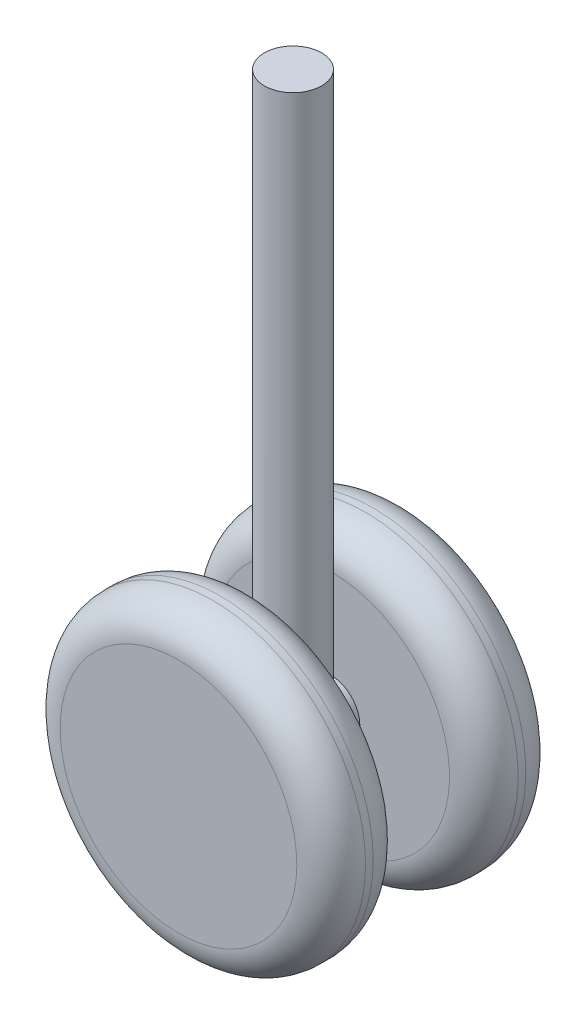
ISO-10303-21;
HEADER;
FILE_DESCRIPTION(('STEP AP214'),'2;1');
FILE_NAME('part.step','',(''),(''),'','','');
FILE_SCHEMA(('AUTOMOTIVE_DESIGN { 1 0 10303 214 1 1 1 1 }'));
ENDSEC;
DATA;
#1=APPLICATION_CONTEXT('core data for automotive mechanical design processes');
#2=APPLICATION_PROTOCOL_DEFINITION('international standard','automotive_design',2000,#1);
#3=PRODUCT_CONTEXT('',#1,'mechanical');
#4=PRODUCT('Part','Part','',(#3));
#5=PRODUCT_RELATED_PRODUCT_CATEGORY('part','',(#4));
#6=PRODUCT_DEFINITION_FORMATION('','',#4);
#7=PRODUCT_DEFINITION_CONTEXT('part definition',#1,'design');
#8=PRODUCT_DEFINITION('design','',#6,#7);
#9=PRODUCT_DEFINITION_SHAPE('','',#8);
#10=(LENGTH_UNIT() NAMED_UNIT(*) SI_UNIT(.MILLI.,.METRE.));
#11=(NAMED_UNIT(*) PLANE_ANGLE_UNIT() SI_UNIT($,.RADIAN.));
#12=(NAMED_UNIT(*) SI_UNIT($,.STERADIAN.) SOLID_ANGLE_UNIT());
#13=UNCERTAINTY_MEASURE_WITH_UNIT(LENGTH_MEASURE(1.E-05),#10,'distance_accuracy_value','');
#14=(GEOMETRIC_REPRESENTATION_CONTEXT(3) GLOBAL_UNCERTAINTY_ASSIGNED_CONTEXT((#13)) GLOBAL_UNIT_ASSIGNED_CONTEXT((#10,
#11,#12)) REPRESENTATION_CONTEXT('',''));
#15=CARTESIAN_POINT('',(0.,0.,0.));
#16=DIRECTION('',(0.,0.,1.));
#17=DIRECTION('',(1.,0.,0.));
#18=AXIS2_PLACEMENT_3D('',#15,#16,#17);
#19=CARTESIAN_POINT('',(0.,0.,-200.));
#20=DIRECTION('',(0.,0.,1.));
#21=DIRECTION('',(1.,0.,0.));
#22=AXIS2_PLACEMENT_3D('',#19,#20,#21);
#23=CYLINDRICAL_SURFACE('',#22,75.);
#24=CARTESIAN_POINT('',(0.,0.,100.));
#25=DIRECTION('',(0.,0.,1.));
#26=DIRECTION('',(1.,0.,0.));
#27=AXIS2_PLACEMENT_3D('',#24,#25,#26);
#28=CIRCLE('',#27,75.);
#29=CARTESIAN_POINT('',(75.,0.,100.));
#30=VERTEX_POINT('',#29);
#31=EDGE_CURVE('E52',#30,#30,#28,.F.);
#32=ORIENTED_EDGE('',*,*,#31,.T.);
#33=EDGE_LOOP('',(#32));
#34=FACE_BOUND('',#33,.T.);
#35=CARTESIAN_POINT('',(0.,0.,0.));
#36=DIRECTION('',(0.,-0.707106781186547,0.707106781186547));
#37=DIRECTION('',(0.,-0.707106781186547,-0.707106781186547));
#38=AXIS2_PLACEMENT_3D('',#35,#36,#37);
#39=ELLIPSE('',#38,106.066017177982,75.);
#40=CARTESIAN_POINT('',(-75.,0.,0.));
#41=VERTEX_POINT('',#40);
#42=CARTESIAN_POINT('',(75.,0.,0.));
#43=VERTEX_POINT('',#42);
#44=EDGE_CURVE('E47',#41,#43,#39,.F.);
#45=ORIENTED_EDGE('',*,*,#44,.F.);
#46=CARTESIAN_POINT('',(0.,0.,0.));
#47=DIRECTION('',(0.,-0.707106781186547,-0.707106781186547));
#48=DIRECTION('',(0.,-0.707106781186547,0.707106781186547));
#49=AXIS2_PLACEMENT_3D('',#46,#47,#48);
#50=ELLIPSE('',#49,106.066017177982,75.);
#51=EDGE_CURVE('E49',#43,#41,#50,.F.);
#52=ORIENTED_EDGE('',*,*,#51,.F.);
#53=EDGE_LOOP('',(#45,#52));
#54=FACE_BOUND('',#53,.T.);
#55=CARTESIAN_POINT('',(0.,0.,-100.));
#56=DIRECTION('',(0.,0.,-1.));
#57=DIRECTION('',(-1.,0.,0.));
#58=AXIS2_PLACEMENT_3D('',#55,#56,#57);
#59=CIRCLE('',#58,75.);
#60=CARTESIAN_POINT('',(-75.,0.,-100.));
#61=VERTEX_POINT('',#60);
#62=EDGE_CURVE('E63',#61,#61,#59,.F.);
#63=ORIENTED_EDGE('',*,*,#62,.T.);
#64=EDGE_LOOP('',(#63));
#65=FACE_BOUND('',#64,.T.);
#66=ADVANCED_FACE('F33',(#34,#54,#65),#23,.T.);
#67=CARTESIAN_POINT('',(0.,1500.,0.));
#68=DIRECTION('',(0.,-1.,0.));
#69=DIRECTION('',(0.,0.,-1.));
#70=AXIS2_PLACEMENT_3D('',#67,#68,#69);
#71=CYLINDRICAL_SURFACE('',#70,75.);
#72=CARTESIAN_POINT('',(0.,1500.,0.));
#73=DIRECTION('',(0.,1.,0.));
#74=DIRECTION('',(0.,0.,1.));
#75=AXIS2_PLACEMENT_3D('',#72,#73,#74);
#76=CIRCLE('',#75,75.);
#77=CARTESIAN_POINT('',(0.,1500.,75.));
#78=VERTEX_POINT('',#77);
#79=EDGE_CURVE('E55',#78,#78,#76,.T.);
#80=ORIENTED_EDGE('',*,*,#79,.F.);
#81=EDGE_LOOP('',(#80));
#82=FACE_BOUND('',#81,.T.);
#83=ORIENTED_EDGE('',*,*,#51,.T.);
#84=ORIENTED_EDGE('',*,*,#44,.T.);
#85=EDGE_LOOP('',(#83,#84));
#86=FACE_BOUND('',#85,.T.);
#87=ADVANCED_FACE('F54',(#82,#86),#71,.T.);
#88=CARTESIAN_POINT('',(0.,1500.,0.));
#89=DIRECTION('',(0.,1.,0.));
#90=DIRECTION('',(0.,0.,1.));
#91=AXIS2_PLACEMENT_3D('',#88,#89,#90);
#92=PLANE('',#91);
#93=ORIENTED_EDGE('',*,*,#79,.T.);
#94=EDGE_LOOP('',(#93));
#95=FACE_BOUND('',#94,.T.);
#96=ADVANCED_FACE('F114',(#95),#92,.T.);
#97=CARTESIAN_POINT('',(0.,0.,100.));
#98=DIRECTION('',(0.,0.,1.));
#99=DIRECTION('',(1.,0.,0.));
#100=AXIS2_PLACEMENT_3D('',#97,#98,#99);
#101=CYLINDRICAL_SURFACE('',#100,400.);
#102=CARTESIAN_POINT('',(0.,0.,210.));
#103=DIRECTION('',(0.,0.,1.));
#104=DIRECTION('',(1.,0.,0.));
#105=AXIS2_PLACEMENT_3D('',#102,#103,#104);
#106=CIRCLE('',#105,400.);
#107=CARTESIAN_POINT('',(400.,0.,210.));
#108=VERTEX_POINT('',#107);
#109=EDGE_CURVE('E69',#108,#108,#106,.F.);
#110=CARTESIAN_POINT('',(0.,0.,190.));
#111=DIRECTION('',(0.,0.,1.));
#112=DIRECTION('',(1.,0.,0.));
#113=AXIS2_PLACEMENT_3D('',#110,#111,#112);
#114=CIRCLE('',#113,400.);
#115=CARTESIAN_POINT('',(400.,0.,190.));
#116=VERTEX_POINT('',#115);
#117=EDGE_CURVE('E66',#116,#116,#114,.T.);
#118=CARTESIAN_POINT('',(400.,0.,210.));
#119=CARTESIAN_POINT('',(400.,0.,209.791666666667));
#120=CARTESIAN_POINT('',(400.,0.,209.583333333333));
#121=CARTESIAN_POINT('',(400.,0.,209.166666666667));
#122=CARTESIAN_POINT('',(400.,0.,208.958333333333));
#123=CARTESIAN_POINT('',(400.,0.,208.541666666667));
#124=CARTESIAN_POINT('',(400.,0.,208.333333333333));
#125=CARTESIAN_POINT('',(400.,0.,207.916666666667));
#126=CARTESIAN_POINT('',(400.,0.,207.708333333333));
#127=CARTESIAN_POINT('',(400.,0.,207.291666666667));
#128=CARTESIAN_POINT('',(400.,0.,207.083333333333));
#129=CARTESIAN_POINT('',(400.,0.,206.666666666667));
#130=CARTESIAN_POINT('',(400.,0.,206.458333333333));
#131=CARTESIAN_POINT('',(400.,0.,206.041666666667));
#132=CARTESIAN_POINT('',(400.,0.,205.833333333333));
#133=CARTESIAN_POINT('',(400.,0.,205.416666666667));
#134=CARTESIAN_POINT('',(400.,0.,205.208333333333));
#135=CARTESIAN_POINT('',(400.,0.,204.791666666667));
#136=CARTESIAN_POINT('',(400.,0.,204.583333333333));
#137=CARTESIAN_POINT('',(400.,0.,204.166666666667));
#138=CARTESIAN_POINT('',(400.,0.,203.958333333333));
#139=CARTESIAN_POINT('',(400.,0.,203.541666666667));
#140=CARTESIAN_POINT('',(400.,0.,203.333333333333));
#141=CARTESIAN_POINT('',(400.,0.,202.916666666667));
#142=CARTESIAN_POINT('',(400.,0.,202.708333333333));
#143=CARTESIAN_POINT('',(400.,0.,202.291666666667));
#144=CARTESIAN_POINT('',(400.,0.,202.083333333333));
#145=CARTESIAN_POINT('',(400.,0.,201.666666666667));
#146=CARTESIAN_POINT('',(400.,0.,201.458333333333));
#147=CARTESIAN_POINT('',(400.,0.,201.041666666667));
#148=CARTESIAN_POINT('',(400.,0.,200.833333333333));
#149=CARTESIAN_POINT('',(400.,0.,200.416666666667));
#150=CARTESIAN_POINT('',(400.,0.,200.208333333333));
#151=CARTESIAN_POINT('',(400.,0.,199.791666666667));
#152=CARTESIAN_POINT('',(400.,0.,199.583333333333));
#153=CARTESIAN_POINT('',(400.,0.,199.166666666667));
#154=CARTESIAN_POINT('',(400.,0.,198.958333333333));
#155=CARTESIAN_POINT('',(400.,0.,198.541666666667));
#156=CARTESIAN_POINT('',(400.,0.,198.333333333333));
#157=CARTESIAN_POINT('',(400.,0.,197.916666666667));
#158=CARTESIAN_POINT('',(400.,0.,197.708333333333));
#159=CARTESIAN_POINT('',(400.,0.,197.291666666667));
#160=CARTESIAN_POINT('',(400.,0.,197.083333333333));
#161=CARTESIAN_POINT('',(400.,0.,196.666666666667));
#162=CARTESIAN_POINT('',(400.,0.,196.458333333333));
#163=CARTESIAN_POINT('',(400.,0.,196.041666666667));
#164=CARTESIAN_POINT('',(400.,0.,195.833333333333));
#165=CARTESIAN_POINT('',(400.,0.,195.416666666667));
#166=CARTESIAN_POINT('',(400.,0.,195.208333333333));
#167=CARTESIAN_POINT('',(400.,0.,194.791666666667));
#168=CARTESIAN_POINT('',(400.,0.,194.583333333333));
#169=CARTESIAN_POINT('',(400.,0.,194.166666666667));
#170=CARTESIAN_POINT('',(400.,0.,193.958333333333));
#171=CARTESIAN_POINT('',(400.,0.,193.541666666667));
#172=CARTESIAN_POINT('',(400.,0.,193.333333333333));
#173=CARTESIAN_POINT('',(400.,0.,192.916666666667));
#174=CARTESIAN_POINT('',(400.,0.,192.708333333333));
#175=CARTESIAN_POINT('',(400.,0.,192.291666666667));
#176=CARTESIAN_POINT('',(400.,0.,192.083333333333));
#177=CARTESIAN_POINT('',(400.,0.,191.666666666667));
#178=CARTESIAN_POINT('',(400.,0.,191.458333333333));
#179=CARTESIAN_POINT('',(400.,0.,191.041666666667));
#180=CARTESIAN_POINT('',(400.,0.,190.833333333333));
#181=CARTESIAN_POINT('',(400.,0.,190.416666666667));
#182=CARTESIAN_POINT('',(400.,0.,190.208333333333));
#183=CARTESIAN_POINT('',(400.,0.,190.));
#184=B_SPLINE_CURVE_WITH_KNOTS('',3,(#118,#119,#120,#121,#122,#123,#124,#125,#126,#127,#128,
#129,#130,#131,#132,#133,#134,#135,#136,#137,#138,#139,#140,#141,#142,#143,#144,#145,#146,#147,
#148,#149,#150,#151,#152,#153,#154,#155,#156,#157,#158,#159,#160,#161,#162,#163,#164,#165,#166,
#167,#168,#169,#170,#171,#172,#173,#174,#175,#176,#177,#178,#179,#180,#181,#182,#183),
.UNSPECIFIED.,.F.,.F.,(4,2,2,2,2,2,2,2,2,2,2,2,2,2,2,2,2,2,2,2,2,2,2,2,2,2,2,2,2,2,2,2,4),(0.,
0.625000000000014,1.25,1.87499999999999,2.5,3.12500000000002,3.75,4.37499999999999,5.,
5.62500000000002,6.25000000000001,6.87499999999999,7.50000000000001,8.12500000000002,
8.75000000000001,9.37499999999999,10.,10.625,11.25,11.875,12.5,13.125,13.75,14.375,15.,15.625,
16.25,16.875,17.5,18.125,18.75,19.375,20.),.UNSPECIFIED.);
#185=EDGE_CURVE('BSEAM119',#108,#116,#184,.T.);
#186=ORIENTED_EDGE('',*,*,#109,.T.);
#187=ORIENTED_EDGE('',*,*,#117,.T.);
#188=ORIENTED_EDGE('',*,*,#185,.T.);
#189=ORIENTED_EDGE('',*,*,#185,.F.);
#190=EDGE_LOOP('',(#186,#188,#187,#189));
#191=FACE_BOUND('',#190,.T.);
#192=ADVANCED_FACE('F119',(#191),#101,.T.);
#193=CARTESIAN_POINT('',(0.,0.,100.));
#194=DIRECTION('',(0.,0.,1.));
#195=DIRECTION('',(1.,0.,0.));
#196=AXIS2_PLACEMENT_3D('',#193,#194,#195);
#197=PLANE('',#196);
#198=CARTESIAN_POINT('',(0.,0.,100.));
#199=DIRECTION('',(0.,0.,1.));
#200=DIRECTION('',(1.,0.,0.));
#201=AXIS2_PLACEMENT_3D('',#198,#199,#200);
#202=CIRCLE('',#201,310.);
#203=CARTESIAN_POINT('',(310.,0.,100.));
#204=VERTEX_POINT('',#203);
#205=EDGE_CURVE('E72',#204,#204,#202,.F.);
#206=ORIENTED_EDGE('',*,*,#205,.T.);
#207=EDGE_LOOP('',(#206));
#208=FACE_BOUND('',#207,.T.);
#209=ORIENTED_EDGE('',*,*,#31,.F.);
#210=EDGE_LOOP('',(#209));
#211=FACE_BOUND('',#210,.T.);
#212=ADVANCED_FACE('F138',(#208,#211),#197,.F.);
#213=CARTESIAN_POINT('',(0.,0.,300.));
#214=DIRECTION('',(0.,0.,1.));
#215=DIRECTION('',(1.,0.,0.));
#216=AXIS2_PLACEMENT_3D('',#213,#214,#215);
#217=PLANE('',#216);
#218=CARTESIAN_POINT('',(0.,0.,300.));
#219=DIRECTION('',(0.,0.,1.));
#220=DIRECTION('',(1.,0.,0.));
#221=AXIS2_PLACEMENT_3D('',#218,#219,#220);
#222=CIRCLE('',#221,310.);
#223=CARTESIAN_POINT('',(310.,0.,300.));
#224=VERTEX_POINT('',#223);
#225=EDGE_CURVE('E58',#224,#224,#222,.T.);
#226=ORIENTED_EDGE('',*,*,#225,.T.);
#227=EDGE_LOOP('',(#226));
#228=FACE_BOUND('',#227,.T.);
#229=ADVANCED_FACE('F127',(#228),#217,.T.);
#230=CARTESIAN_POINT('',(0.,0.,210.));
#231=DIRECTION('',(0.,0.,1.));
#232=DIRECTION('',(1.,0.,0.));
#233=AXIS2_PLACEMENT_3D('',#230,#231,#232);
#234=TOROIDAL_SURFACE('',#233,310.,90.);
#235=ORIENTED_EDGE('',*,*,#109,.F.);
#236=EDGE_LOOP('',(#235));
#237=FACE_BOUND('',#236,.T.);
#238=ORIENTED_EDGE('',*,*,#225,.F.);
#239=EDGE_LOOP('',(#238));
#240=FACE_BOUND('',#239,.T.);
#241=ADVANCED_FACE('F124',(#237,#240),#234,.T.);
#242=CARTESIAN_POINT('',(0.,0.,190.));
#243=DIRECTION('',(0.,0.,1.));
#244=DIRECTION('',(1.,0.,0.));
#245=AXIS2_PLACEMENT_3D('',#242,#243,#244);
#246=TOROIDAL_SURFACE('',#245,310.,90.);
#247=ORIENTED_EDGE('',*,*,#205,.F.);
#248=EDGE_LOOP('',(#247));
#249=FACE_BOUND('',#248,.T.);
#250=ORIENTED_EDGE('',*,*,#117,.F.);
#251=EDGE_LOOP('',(#250));
#252=FACE_BOUND('',#251,.T.);
#253=ADVANCED_FACE('F96',(#249,#252),#246,.T.);
#254=CARTESIAN_POINT('',(0.,0.,-100.));
#255=DIRECTION('',(0.,0.,-1.));
#256=DIRECTION('',(-1.,0.,0.));
#257=AXIS2_PLACEMENT_3D('',#254,#255,#256);
#258=CYLINDRICAL_SURFACE('',#257,400.);
#259=CARTESIAN_POINT('',(0.,0.,-210.));
#260=DIRECTION('',(0.,0.,-1.));
#261=DIRECTION('',(-1.,0.,0.));
#262=AXIS2_PLACEMENT_3D('',#259,#260,#261);
#263=CIRCLE('',#262,400.);
#264=CARTESIAN_POINT('',(-400.,0.,-210.));
#265=VERTEX_POINT('',#264);
#266=EDGE_CURVE('E80',#265,#265,#263,.F.);
#267=CARTESIAN_POINT('',(0.,0.,-190.));
#268=DIRECTION('',(0.,0.,-1.));
#269=DIRECTION('',(-1.,0.,0.));
#270=AXIS2_PLACEMENT_3D('',#267,#268,#269);
#271=CIRCLE('',#270,400.);
#272=CARTESIAN_POINT('',(-400.,0.,-190.));
#273=VERTEX_POINT('',#272);
#274=EDGE_CURVE('E75',#273,#273,#271,.T.);
#275=CARTESIAN_POINT('',(-400.,0.,-210.));
#276=CARTESIAN_POINT('',(-400.,0.,-209.791666666667));
#277=CARTESIAN_POINT('',(-400.,0.,-209.583333333333));
#278=CARTESIAN_POINT('',(-400.,0.,-209.166666666667));
#279=CARTESIAN_POINT('',(-400.,0.,-208.958333333333));
#280=CARTESIAN_POINT('',(-400.,0.,-208.541666666667));
#281=CARTESIAN_POINT('',(-400.,0.,-208.333333333333));
#282=CARTESIAN_POINT('',(-400.,0.,-207.916666666667));
#283=CARTESIAN_POINT('',(-400.,0.,-207.708333333333));
#284=CARTESIAN_POINT('',(-400.,0.,-207.291666666667));
#285=CARTESIAN_POINT('',(-400.,0.,-207.083333333333));
#286=CARTESIAN_POINT('',(-400.,0.,-206.666666666667));
#287=CARTESIAN_POINT('',(-400.,0.,-206.458333333333));
#288=CARTESIAN_POINT('',(-400.,0.,-206.041666666667));
#289=CARTESIAN_POINT('',(-400.,0.,-205.833333333333));
#290=CARTESIAN_POINT('',(-400.,0.,-205.416666666667));
#291=CARTESIAN_POINT('',(-400.,0.,-205.208333333333));
#292=CARTESIAN_POINT('',(-400.,0.,-204.791666666667));
#293=CARTESIAN_POINT('',(-400.,0.,-204.583333333333));
#294=CARTESIAN_POINT('',(-400.,0.,-204.166666666667));
#295=CARTESIAN_POINT('',(-400.,0.,-203.958333333333));
#296=CARTESIAN_POINT('',(-400.,0.,-203.541666666667));
#297=CARTESIAN_POINT('',(-400.,0.,-203.333333333333));
#298=CARTESIAN_POINT('',(-400.,0.,-202.916666666667));
#299=CARTESIAN_POINT('',(-400.,0.,-202.708333333333));
#300=CARTESIAN_POINT('',(-400.,0.,-202.291666666667));
#301=CARTESIAN_POINT('',(-400.,0.,-202.083333333333));
#302=CARTESIAN_POINT('',(-400.,0.,-201.666666666667));
#303=CARTESIAN_POINT('',(-400.,0.,-201.458333333333));
#304=CARTESIAN_POINT('',(-400.,0.,-201.041666666667));
#305=CARTESIAN_POINT('',(-400.,0.,-200.833333333333));
#306=CARTESIAN_POINT('',(-400.,0.,-200.416666666667));
#307=CARTESIAN_POINT('',(-400.,0.,-200.208333333333));
#308=CARTESIAN_POINT('',(-400.,0.,-199.791666666667));
#309=CARTESIAN_POINT('',(-400.,0.,-199.583333333333));
#310=CARTESIAN_POINT('',(-400.,0.,-199.166666666667));
#311=CARTESIAN_POINT('',(-400.,0.,-198.958333333333));
#312=CARTESIAN_POINT('',(-400.,0.,-198.541666666667));
#313=CARTESIAN_POINT('',(-400.,0.,-198.333333333333));
#314=CARTESIAN_POINT('',(-400.,0.,-197.916666666667));
#315=CARTESIAN_POINT('',(-400.,0.,-197.708333333333));
#316=CARTESIAN_POINT('',(-400.,0.,-197.291666666667));
#317=CARTESIAN_POINT('',(-400.,0.,-197.083333333333));
#318=CARTESIAN_POINT('',(-400.,0.,-196.666666666667));
#319=CARTESIAN_POINT('',(-400.,0.,-196.458333333333));
#320=CARTESIAN_POINT('',(-400.,0.,-196.041666666667));
#321=CARTESIAN_POINT('',(-400.,0.,-195.833333333333));
#322=CARTESIAN_POINT('',(-400.,0.,-195.416666666667));
#323=CARTESIAN_POINT('',(-400.,0.,-195.208333333333));
#324=CARTESIAN_POINT('',(-400.,0.,-194.791666666667));
#325=CARTESIAN_POINT('',(-400.,0.,-194.583333333333));
#326=CARTESIAN_POINT('',(-400.,0.,-194.166666666667));
#327=CARTESIAN_POINT('',(-400.,0.,-193.958333333333));
#328=CARTESIAN_POINT('',(-400.,0.,-193.541666666667));
#329=CARTESIAN_POINT('',(-400.,0.,-193.333333333333));
#330=CARTESIAN_POINT('',(-400.,0.,-192.916666666667));
#331=CARTESIAN_POINT('',(-400.,0.,-192.708333333333));
#332=CARTESIAN_POINT('',(-400.,0.,-192.291666666667));
#333=CARTESIAN_POINT('',(-400.,0.,-192.083333333333));
#334=CARTESIAN_POINT('',(-400.,0.,-191.666666666667));
#335=CARTESIAN_POINT('',(-400.,0.,-191.458333333333));
#336=CARTESIAN_POINT('',(-400.,0.,-191.041666666667));
#337=CARTESIAN_POINT('',(-400.,0.,-190.833333333333));
#338=CARTESIAN_POINT('',(-400.,0.,-190.416666666667));
#339=CARTESIAN_POINT('',(-400.,0.,-190.208333333333));
#340=CARTESIAN_POINT('',(-400.,0.,-190.));
#341=B_SPLINE_CURVE_WITH_KNOTS('',3,(#275,#276,#277,#278,#279,#280,#281,#282,#283,#284,#285,
#286,#287,#288,#289,#290,#291,#292,#293,#294,#295,#296,#297,#298,#299,#300,#301,#302,#303,#304,
#305,#306,#307,#308,#309,#310,#311,#312,#313,#314,#315,#316,#317,#318,#319,#320,#321,#322,#323,
#324,#325,#326,#327,#328,#329,#330,#331,#332,#333,#334,#335,#336,#337,#338,#339,#340),
.UNSPECIFIED.,.F.,.F.,(4,2,2,2,2,2,2,2,2,2,2,2,2,2,2,2,2,2,2,2,2,2,2,2,2,2,2,2,2,2,2,2,4),(0.,
0.625000000000014,1.25,1.87499999999999,2.5,3.12500000000002,3.75,4.37499999999999,5.,
5.62500000000002,6.25000000000001,6.87499999999999,7.50000000000001,8.12500000000002,
8.75000000000001,9.37499999999999,10.,10.625,11.25,11.875,12.5,13.125,13.75,14.375,15.,15.625,
16.25,16.875,17.5,18.125,18.75,19.375,20.),.UNSPECIFIED.);
#342=EDGE_CURVE('BSEAM92',#265,#273,#341,.T.);
#343=ORIENTED_EDGE('',*,*,#266,.T.);
#344=ORIENTED_EDGE('',*,*,#274,.T.);
#345=ORIENTED_EDGE('',*,*,#342,.T.);
#346=ORIENTED_EDGE('',*,*,#342,.F.);
#347=EDGE_LOOP('',(#343,#345,#344,#346));
#348=FACE_BOUND('',#347,.T.);
#349=ADVANCED_FACE('F92',(#348),#258,.T.);
#350=CARTESIAN_POINT('',(0.,0.,-100.));
#351=DIRECTION('',(0.,0.,-1.));
#352=DIRECTION('',(1.,0.,0.));
#353=AXIS2_PLACEMENT_3D('',#350,#351,#352);
#354=PLANE('',#353);
#355=CARTESIAN_POINT('',(0.,0.,-100.));
#356=DIRECTION('',(0.,0.,-1.));
#357=DIRECTION('',(-1.,0.,0.));
#358=AXIS2_PLACEMENT_3D('',#355,#356,#357);
#359=CIRCLE('',#358,310.);
#360=CARTESIAN_POINT('',(-310.,0.,-100.));
#361=VERTEX_POINT('',#360);
#362=EDGE_CURVE('E11',#361,#361,#359,.F.);
#363=ORIENTED_EDGE('',*,*,#362,.T.);
#364=EDGE_LOOP('',(#363));
#365=FACE_BOUND('',#364,.T.);
#366=ORIENTED_EDGE('',*,*,#62,.F.);
#367=EDGE_LOOP('',(#366));
#368=FACE_BOUND('',#367,.T.);
#369=ADVANCED_FACE('F95',(#365,#368),#354,.F.);
#370=CARTESIAN_POINT('',(0.,0.,-300.));
#371=DIRECTION('',(0.,0.,-1.));
#372=DIRECTION('',(1.,0.,0.));
#373=AXIS2_PLACEMENT_3D('',#370,#371,#372);
#374=PLANE('',#373);
#375=CARTESIAN_POINT('',(0.,0.,-300.));
#376=DIRECTION('',(0.,0.,-1.));
#377=DIRECTION('',(-1.,0.,0.));
#378=AXIS2_PLACEMENT_3D('',#375,#376,#377);
#379=CIRCLE('',#378,310.);
#380=CARTESIAN_POINT('',(-310.,0.,-300.));
#381=VERTEX_POINT('',#380);
#382=EDGE_CURVE('E41',#381,#381,#379,.T.);
#383=ORIENTED_EDGE('',*,*,#382,.T.);
#384=EDGE_LOOP('',(#383));
#385=FACE_BOUND('',#384,.T.);
#386=ADVANCED_FACE('F85',(#385),#374,.T.);
#387=CARTESIAN_POINT('',(0.,0.,-210.));
#388=DIRECTION('',(0.,0.,-1.));
#389=DIRECTION('',(-1.,0.,0.));
#390=AXIS2_PLACEMENT_3D('',#387,#388,#389);
#391=TOROIDAL_SURFACE('',#390,310.,90.);
#392=ORIENTED_EDGE('',*,*,#382,.F.);
#393=EDGE_LOOP('',(#392));
#394=FACE_BOUND('',#393,.T.);
#395=ORIENTED_EDGE('',*,*,#266,.F.);
#396=EDGE_LOOP('',(#395));
#397=FACE_BOUND('',#396,.T.);
#398=ADVANCED_FACE('F87',(#394,#397),#391,.T.);
#399=CARTESIAN_POINT('',(0.,0.,-190.));
#400=DIRECTION('',(0.,0.,-1.));
#401=DIRECTION('',(-1.,0.,0.));
#402=AXIS2_PLACEMENT_3D('',#399,#400,#401);
#403=TOROIDAL_SURFACE('',#402,310.,90.);
#404=ORIENTED_EDGE('',*,*,#274,.F.);
#405=EDGE_LOOP('',(#404));
#406=FACE_BOUND('',#405,.T.);
#407=ORIENTED_EDGE('',*,*,#362,.F.);
#408=EDGE_LOOP('',(#407));
#409=FACE_BOUND('',#408,.T.);
#410=ADVANCED_FACE('F35',(#406,#409),#403,.T.);
#411=CLOSED_SHELL('',(#66,#87,#96,#192,#212,#229,#241,#253,#349,#369,#386,#398,#410));
#412=MANIFOLD_SOLID_BREP('B2',#411);
#413=ADVANCED_BREP_SHAPE_REPRESENTATION('',(#18,#412),#14);
#414=SHAPE_DEFINITION_REPRESENTATION(#9,#413);
ENDSEC;
END-ISO-10303-21;
